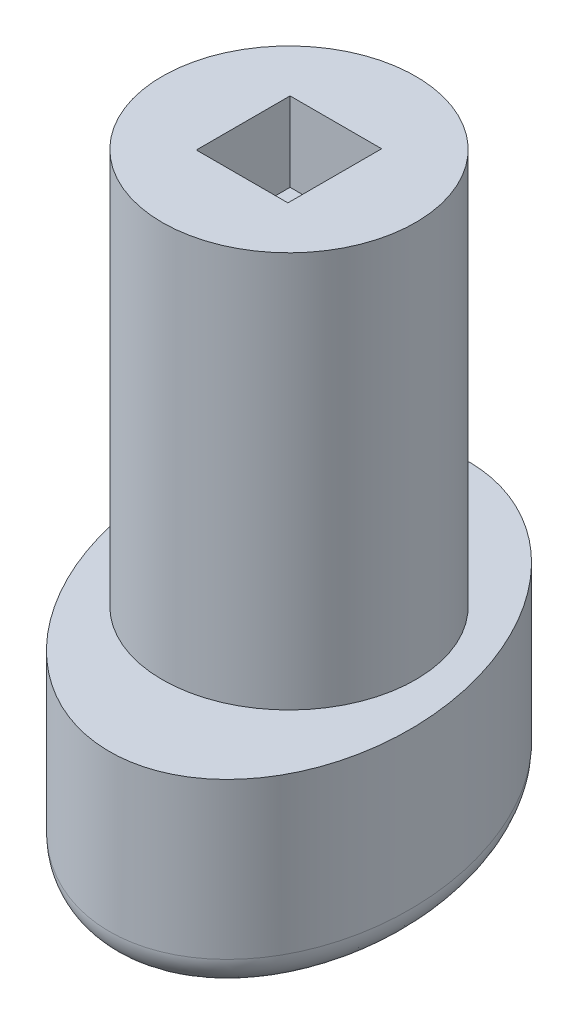
ISO-10303-21;
HEADER;
FILE_DESCRIPTION(('STEP AP214'),'2;1');
FILE_NAME('part.step','',(''),(''),'','','');
FILE_SCHEMA(('AUTOMOTIVE_DESIGN { 1 0 10303 214 1 1 1 1 }'));
ENDSEC;
DATA;
#1=APPLICATION_CONTEXT('core data for automotive mechanical design processes');
#2=APPLICATION_PROTOCOL_DEFINITION('international standard','automotive_design',2000,#1);
#3=PRODUCT_CONTEXT('',#1,'mechanical');
#4=PRODUCT('Part','Part','',(#3));
#5=PRODUCT_RELATED_PRODUCT_CATEGORY('part','',(#4));
#6=PRODUCT_DEFINITION_FORMATION('','',#4);
#7=PRODUCT_DEFINITION_CONTEXT('part definition',#1,'design');
#8=PRODUCT_DEFINITION('design','',#6,#7);
#9=PRODUCT_DEFINITION_SHAPE('','',#8);
#10=(LENGTH_UNIT() NAMED_UNIT(*) SI_UNIT(.MILLI.,.METRE.));
#11=(NAMED_UNIT(*) PLANE_ANGLE_UNIT() SI_UNIT($,.RADIAN.));
#12=(NAMED_UNIT(*) SI_UNIT($,.STERADIAN.) SOLID_ANGLE_UNIT());
#13=UNCERTAINTY_MEASURE_WITH_UNIT(LENGTH_MEASURE(1.E-05),#10,'distance_accuracy_value','');
#14=(GEOMETRIC_REPRESENTATION_CONTEXT(3) GLOBAL_UNCERTAINTY_ASSIGNED_CONTEXT((#13)) GLOBAL_UNIT_ASSIGNED_CONTEXT((#10,
#11,#12)) REPRESENTATION_CONTEXT('',''));
#15=CARTESIAN_POINT('',(0.,0.,0.));
#16=DIRECTION('',(0.,0.,1.));
#17=DIRECTION('',(1.,0.,0.));
#18=AXIS2_PLACEMENT_3D('',#15,#16,#17);
#19=CARTESIAN_POINT('',(0.,3.,0.));
#20=DIRECTION('',(0.,1.,0.));
#21=DIRECTION('',(-0.340289157419413,0.,-0.940320843830863));
#22=AXIS2_PLACEMENT_3D('',#19,#20,#21);
#23=ELLIPSE('',#22,3.556,2.54);
#24=DIRECTION('',(0.,-1.,0.));
#25=VECTOR('',#24,1.);
#26=SURFACE_OF_LINEAR_EXTRUSION('',#23,#25);
#27=CARTESIAN_POINT('',(-0.730471010995182,0.,-2.94518528881984));
#28=CARTESIAN_POINT('',(-0.785144492569507,0.,-3.44218711015709));
#29=CARTESIAN_POINT('',(-0.785144492569507,0.5,-3.44218711015709));
#30=CARTESIAN_POINT('',(-0.81489768546168,0.,-2.93589235521596));
#31=CARTESIAN_POINT('',(-0.899922225958826,0.,-3.42954435354896));
#32=CARTESIAN_POINT('',(-0.899922225958826,0.5,-3.42954435354896));
#33=CARTESIAN_POINT('',(-0.898508559988892,0.,-2.91880717279725));
#34=CARTESIAN_POINT('',(-1.01496058466802,0.,-3.40612836759495));
#35=CARTESIAN_POINT('',(-1.01496058466802,0.5,-3.40612836759495));
#36=CARTESIAN_POINT('',(-1.06083555848532,0.,-2.86877687241943));
#37=CARTESIAN_POINT('',(-1.23886538848554,0.,-3.33711275074755));
#38=CARTESIAN_POINT('',(-1.23886538848554,0.5,-3.33711275074755));
#39=CARTESIAN_POINT('',(-1.13955381588871,0.,-2.83583872274155));
#40=CARTESIAN_POINT('',(-1.34773452184082,0.,-3.29152286645141));
#41=CARTESIAN_POINT('',(-1.34773452184082,0.5,-3.29152286645141));
#42=CARTESIAN_POINT('',(-1.28036609506595,0.,-2.7604430612569));
#43=CARTESIAN_POINT('',(-1.54100195085765,0.,-3.18806073367684));
#44=CARTESIAN_POINT('',(-1.54100195085765,0.5,-3.18806073367684));
#45=CARTESIAN_POINT('',(-1.34332462021724,0.,-2.71957686103553));
#46=CARTESIAN_POINT('',(-1.62677121603788,0.,-3.13228511790827));
#47=CARTESIAN_POINT('',(-1.62677121603788,0.5,-3.13228511790827));
#48=CARTESIAN_POINT('',(-1.4621266667632,0.,-2.62858886412975));
#49=CARTESIAN_POINT('',(-1.78675294380044,0.,-3.00976182239429));
#50=CARTESIAN_POINT('',(-1.78675294380044,0.5,-3.00976182239429));
#51=CARTESIAN_POINT('',(-1.51796638079841,0.,-2.57846214944343));
#52=CARTESIAN_POINT('',(-1.86095922681993,0.,-2.9430083146739));
#53=CARTESIAN_POINT('',(-1.86095922681993,0.5,-2.9430083146739));
#54=CARTESIAN_POINT('',(-1.64141338203356,0.,-2.45096305092648));
#55=CARTESIAN_POINT('',(-2.02286825880082,0.,-2.77580390405774));
#56=CARTESIAN_POINT('',(-2.02286825880082,0.5,-2.77580390405774));
#57=CARTESIAN_POINT('',(-1.70570122684311,0.,-2.37038180638983));
#58=CARTESIAN_POINT('',(-2.10536524118031,0.,-2.67203895511301));
#59=CARTESIAN_POINT('',(-2.10536524118031,0.5,-2.67203895511301));
#60=CARTESIAN_POINT('',(-1.82048171081272,0.,-2.19994419751691));
#61=CARTESIAN_POINT('',(-2.25034115299757,0.,-2.45675892936829));
#62=CARTESIAN_POINT('',(-2.25034115299757,0.5,-2.45675892936829));
#63=CARTESIAN_POINT('',(-1.87094594266222,0.,-2.1100692488419));
#64=CARTESIAN_POINT('',(-2.31277890583431,0.,-2.34522847541224));
#65=CARTESIAN_POINT('',(-2.31277890583431,0.5,-2.34522847541224));
#66=CARTESIAN_POINT('',(-1.97800426094272,0.,-1.88469362633907));
#67=CARTESIAN_POINT('',(-2.44363144769078,0.,-2.06979116926253));
#68=CARTESIAN_POINT('',(-2.44363144769078,0.5,-2.06979116926253));
#69=CARTESIAN_POINT('',(-2.0280256511929,0.,-1.74608836214794));
#70=CARTESIAN_POINT('',(-2.50322824099576,0.,-1.90384213831112));
#71=CARTESIAN_POINT('',(-2.50322824099576,0.5,-1.90384213831112));
#72=CARTESIAN_POINT('',(-2.10578195637571,0.,-1.46279824786919));
#73=CARTESIAN_POINT('',(-2.59493398242508,0.,-1.56965766960587));
#74=CARTESIAN_POINT('',(-2.59493398242508,0.5,-1.56965766960587));
#75=CARTESIAN_POINT('',(-2.13347538475012,0.,-1.3181026037755));
#76=CARTESIAN_POINT('',(-2.62699176878793,0.,-1.40141856360819));
#77=CARTESIAN_POINT('',(-2.62699176878793,0.5,-1.40141856360819));
#78=CARTESIAN_POINT('',(-2.16432813321979,0.,-1.06801680554859));
#79=CARTESIAN_POINT('',(-2.66250851344363,0.,-1.11346658607708));
#80=CARTESIAN_POINT('',(-2.66250851344363,0.5,-1.11346658607708));
#81=CARTESIAN_POINT('',(-2.17222835269463,0.,-0.963168016220344));
#82=CARTESIAN_POINT('',(-2.67151197471953,0.,-0.993578563802488));
#83=CARTESIAN_POINT('',(-2.67151197471953,0.5,-0.993578563802488));
#84=CARTESIAN_POINT('',(-2.17894110868656,0.,-0.753161636583998));
#85=CARTESIAN_POINT('',(-2.67914717635678,0.,-0.754694162717866));
#86=CARTESIAN_POINT('',(-2.67914717635678,0.5,-0.754694162717866));
#87=CARTESIAN_POINT('',(-2.17774986504002,0.,-0.648003936000331));
#88=CARTESIAN_POINT('',(-2.6777746024411,0.,-0.635698175395758));
#89=CARTESIAN_POINT('',(-2.6777746024411,0.5,-0.635698175395758));
#90=CARTESIAN_POINT('',(-2.1615690060014,0.,-0.333129924693955));
#91=CARTESIAN_POINT('',(-2.65954053656584,0.,-0.280715056169561));
#92=CARTESIAN_POINT('',(-2.65954053656584,0.5,-0.280715056169561));
#93=CARTESIAN_POINT('',(-2.13397569484041,0.,-0.123980917801874));
#94=CARTESIAN_POINT('',(-2.62856653205763,0.,-0.0466963984730983));
#95=CARTESIAN_POINT('',(-2.62856653205763,0.5,-0.0466963984730983));
#96=CARTESIAN_POINT('',(-2.04780552301204,0.,0.293643445334162));
#97=CARTESIAN_POINT('',(-2.53244870884226,0.,0.419092544820542));
#98=CARTESIAN_POINT('',(-2.53244870884226,0.5,0.419092544820542));
#99=CARTESIAN_POINT('',(-1.98839605907958,0.,0.501941518637557));
#100=CARTESIAN_POINT('',(-2.46638707633696,0.,0.650623292784962));
#101=CARTESIAN_POINT('',(-2.46638707633696,0.5,0.650623292784962));
#102=CARTESIAN_POINT('',(-1.84031944572305,0.,0.90788867722582));
#103=CARTESIAN_POINT('',(-2.30177914404577,0.,1.10189094562089));
#104=CARTESIAN_POINT('',(-2.30177914404577,0.5,1.10189094562089));
#105=CARTESIAN_POINT('',(-1.75164979191361,0.,1.1055368492985));
#106=CARTESIAN_POINT('',(-2.20323006365361,0.,1.32162683909614));
#107=CARTESIAN_POINT('',(-2.20323006365361,0.5,1.32162683909614));
#108=CARTESIAN_POINT('',(-1.54932816794133,0.,1.47920729978586));
#109=CARTESIAN_POINT('',(-1.97752592017151,0.,1.73850244473853));
#110=CARTESIAN_POINT('',(-1.97752592017151,0.5,1.73850244473853));
#111=CARTESIAN_POINT('',(-1.43662456935511,0.,1.65573544284738));
#112=CARTESIAN_POINT('',(-1.85145336505489,0.,1.93615553816759));
#113=CARTESIAN_POINT('',(-1.85145336505489,0.5,1.93615553816759));
#114=CARTESIAN_POINT('',(-1.24776797292666,0.,1.90531107551697));
#115=CARTESIAN_POINT('',(-1.63843877024675,0.,2.21764284977897));
#116=CARTESIAN_POINT('',(-1.63843877024675,0.5,2.21764284977897));
#117=CARTESIAN_POINT('',(-1.18152579218462,0.,1.98595705371092));
#118=CARTESIAN_POINT('',(-1.56346127701999,0.,2.30896198245016));
#119=CARTESIAN_POINT('',(-1.56346127701999,0.5,2.30896198245016));
#120=CARTESIAN_POINT('',(-1.04235097471278,0.,2.14122692452285));
#121=CARTESIAN_POINT('',(-1.40506531668567,0.,2.48567733885662));
#122=CARTESIAN_POINT('',(-1.40506531668567,0.5,2.48567733885662));
#123=CARTESIAN_POINT('',(-0.969421350434968,0.,2.21585350046461));
#124=CARTESIAN_POINT('',(-1.32165064849273,0.,2.57107619931288));
#125=CARTESIAN_POINT('',(-1.32165064849273,0.5,2.57107619931288));
#126=CARTESIAN_POINT('',(-0.791984675083535,0.,2.38098256869189));
#127=CARTESIAN_POINT('',(-1.11722737940361,0.,2.76132773972219));
#128=CARTESIAN_POINT('',(-1.11722737940361,0.5,2.76132773972219));
#129=CARTESIAN_POINT('',(-0.684913180590488,0.,2.46877255884947));
#130=CARTESIAN_POINT('',(-0.992806203206982,0.,2.86349398953435));
#131=CARTESIAN_POINT('',(-0.992806203206983,0.5,2.86349398953435));
#132=CARTESIAN_POINT('',(-0.459016842541146,0.,2.62769753921258));
#133=CARTESIAN_POINT('',(-0.726567662121788,0.,3.05081739350604));
#134=CARTESIAN_POINT('',(-0.726567662121788,0.5,3.05081739350604));
#135=CARTESIAN_POINT('',(-0.340209468753977,0.,2.6988567695375));
#136=CARTESIAN_POINT('',(-0.58477608105497,0.,3.13599927623143));
#137=CARTESIAN_POINT('',(-0.58477608105497,0.5,3.13599927623143));
#138=CARTESIAN_POINT('',(-0.124254862782633,0.,2.80319893164604));
#139=CARTESIAN_POINT('',(-0.32181559333763,0.,3.26304448310769));
#140=CARTESIAN_POINT('',(-0.32181559333763,0.5,3.26304448310769));
#141=CARTESIAN_POINT('',(-0.0295706001214522,0.,2.84144668909322));
#142=CARTESIAN_POINT('',(-0.204953562813145,0.,3.31041059652297));
#143=CARTESIAN_POINT('',(-0.204953562813145,0.5,3.31041059652297));
#144=CARTESIAN_POINT('',(0.164686733969052,0.,2.9027050114404));
#145=CARTESIAN_POINT('',(0.0392210338017717,0.,3.38741299961639));
#146=CARTESIAN_POINT('',(0.0392210338017715,0.5,3.38741299961639));
#147=CARTESIAN_POINT('',(0.26425391733135,0.,2.92573346573911));
#148=CARTESIAN_POINT('',(0.166521131906821,0.,3.41707010122745));
#149=CARTESIAN_POINT('',(0.166521131906821,0.5,3.41707010122745));
#150=CARTESIAN_POINT('',(0.444402042920759,0.,2.95011439060232));
#151=CARTESIAN_POINT('',(0.401483783608818,0.,3.44886008286069));
#152=CARTESIAN_POINT('',(0.401483783608818,0.5,3.44886008286069));
#153=CARTESIAN_POINT('',(0.524492806207562,0.,2.955047631363));
#154=CARTESIAN_POINT('',(0.507528589185382,0.,3.45552085498266));
#155=CARTESIAN_POINT('',(0.507528589185382,0.5,3.45552085498266));
#156=CARTESIAN_POINT('',(0.684330191267244,0.,2.95168891345141));
#157=CARTESIAN_POINT('',(0.722096587566092,0.,3.45099932981075));
#158=CARTESIAN_POINT('',(0.722096587566092,0.5,3.45099932981075));
#159=CARTESIAN_POINT('',(0.764077166659706,0.,2.94343125835332));
#160=CARTESIAN_POINT('',(0.830612630853739,0.,3.43986331390675));
#161=CARTESIAN_POINT('',(0.830612630853739,0.5,3.43986331390674));
#162=CARTESIAN_POINT('',(0.875948517205769,0.,2.92164929652531));
#163=CARTESIAN_POINT('',(0.98401563864138,0.,3.40999850794159));
#164=CARTESIAN_POINT('',(0.984015638641381,0.5,3.40999850794159));
#165=CARTESIAN_POINT('',(0.909250100982067,0.,2.91382948892636));
#166=CARTESIAN_POINT('',(1.029833988143,0.,3.39924277068809));
#167=CARTESIAN_POINT('',(1.02983398814301,0.5,3.39924277068809));
#168=CARTESIAN_POINT('',(0.975155996317847,0.,2.89563752929529));
#169=CARTESIAN_POINT('',(1.12066189928518,0.,3.37417249502259));
#170=CARTESIAN_POINT('',(1.12066189928518,0.5,3.3741724950226));
#171=CARTESIAN_POINT('',(1.00776015148015,0.,2.88526481116585));
#172=CARTESIAN_POINT('',(1.16567127916152,0.,3.35985716727891));
#173=CARTESIAN_POINT('',(1.16567127916152,0.5,3.35985716727891));
#174=CARTESIAN_POINT('',(1.1149244663784,0.,2.84646759583103));
#175=CARTESIAN_POINT('',(1.31359573658709,0.,3.30629336897836));
#176=CARTESIAN_POINT('',(1.31359573658709,0.5,3.30629336897836));
#177=CARTESIAN_POINT('',(1.18752924844856,0.,2.81240031036022));
#178=CARTESIAN_POINT('',(1.41379317876911,0.,3.25923069822097));
#179=CARTESIAN_POINT('',(1.41379317876911,0.5,3.25923069822097));
#180=CARTESIAN_POINT('',(1.32564350778145,0.,2.73197243441348));
#181=CARTESIAN_POINT('',(1.602757690793,0.,3.14920831876257));
#182=CARTESIAN_POINT('',(1.602757690793,0.5,3.14920831876257));
#183=CARTESIAN_POINT('',(1.39113827530862,0.,2.68558701728831));
#184=CARTESIAN_POINT('',(1.69150113275132,0.,3.08621651799011));
#185=CARTESIAN_POINT('',(1.69150113275132,0.5,3.08621651799011));
#186=CARTESIAN_POINT('',(1.51329401990618,0.,2.58328454525604));
#187=CARTESIAN_POINT('',(1.85485116468335,0.,2.94942663712318));
#188=CARTESIAN_POINT('',(1.85485116468335,0.5,2.94942663712318));
#189=CARTESIAN_POINT('',(1.57001654686296,0.,2.52744026104798));
#190=CARTESIAN_POINT('',(1.92955712677572,0.,2.87571162429183));
#191=CARTESIAN_POINT('',(1.92955712677572,0.5,2.87571162429183));
#192=CARTESIAN_POINT('',(1.67492650255634,0.,2.40833265619828));
#193=CARTESIAN_POINT('',(2.0658335392793,0.,2.72099122487934));
#194=CARTESIAN_POINT('',(2.0658335392793,0.5,2.72099122487934));
#195=CARTESIAN_POINT('',(1.72311232390547,0.,2.34506794207353));
#196=CARTESIAN_POINT('',(2.12740151636745,0.,2.63998446964768));
#197=CARTESIAN_POINT('',(2.12740151636745,0.5,2.63998446964768));
#198=CARTESIAN_POINT('',(1.83611728321779,0.,2.17581264817431));
#199=CARTESIAN_POINT('',(2.27001304453329,0.,2.42641494298061));
#200=CARTESIAN_POINT('',(2.27001304453329,0.5,2.42641494298061));
#201=CARTESIAN_POINT('',(1.89499140064603,0.,2.06584778944419));
#202=CARTESIAN_POINT('',(2.34245828720163,0.,2.29054091353212));
#203=CARTESIAN_POINT('',(2.34245828720163,0.5,2.29054091353212));
#204=CARTESIAN_POINT('',(1.99464877269713,0.,1.83798805303207));
#205=CARTESIAN_POINT('',(2.46343664048845,0.,2.01389097807368));
#206=CARTESIAN_POINT('',(2.46343664048845,0.5,2.01389097807368));
#207=CARTESIAN_POINT('',(2.03538381649757,0.,1.72007299029043));
#208=CARTESIAN_POINT('',(2.5119060645418,0.,1.87310306886219));
#209=CARTESIAN_POINT('',(2.5119060645418,0.5,1.87310306886219));
#210=CARTESIAN_POINT('',(2.115639679733,0.,1.42569423243151));
#211=CARTESIAN_POINT('',(2.6065607759414,0.,1.52596295789045));
#212=CARTESIAN_POINT('',(2.6065607759414,0.5,1.52596295789045));
#213=CARTESIAN_POINT('',(2.14631425947081,0.,1.24682562398539));
#214=CARTESIAN_POINT('',(2.64184134068041,0.,1.31869883133375));
#215=CARTESIAN_POINT('',(2.64184134068041,0.5,1.31869883133375));
#216=CARTESIAN_POINT('',(2.17926703875737,0.,0.886644548104238));
#217=CARTESIAN_POINT('',(2.67958497607501,0.,0.905835379563996));
#218=CARTESIAN_POINT('',(2.67958497607501,0.5,0.905835379563996));
#219=CARTESIAN_POINT('',(2.18150398315006,0.,0.70532891206962));
#220=CARTESIAN_POINT('',(2.68200036879828,0.,0.70023890535146));
#221=CARTESIAN_POINT('',(2.68200036879828,0.5,0.70023890535146));
#222=CARTESIAN_POINT('',(2.15793151067772,0.,0.285174278215467));
#223=CARTESIAN_POINT('',(2.6554472209351,0.,0.22677661948283));
#224=CARTESIAN_POINT('',(2.6554472209351,0.5,0.22677661948283));
#225=CARTESIAN_POINT('',(2.12274246558242,0.,0.0468496575992637));
#226=CARTESIAN_POINT('',(2.61599218155926,0.,-0.0395419906370937));
#227=CARTESIAN_POINT('',(2.61599218155926,0.5,-0.0395419906370937));
#228=CARTESIAN_POINT('',(2.01413964057488,0.,-0.420954874689913));
#229=CARTESIAN_POINT('',(2.49497332442414,0.,-0.560752328354205));
#230=CARTESIAN_POINT('',(2.49497332442414,0.5,-0.560752328354205));
#231=CARTESIAN_POINT('',(1.94067544432023,0.,-0.650422690871272));
#232=CARTESIAN_POINT('',(2.41335396868462,0.,-0.815628501750752));
#233=CARTESIAN_POINT('',(2.41335396868462,0.5,-0.815628501750752));
#234=CARTESIAN_POINT('',(1.75698144848971,0.,-1.09729127048005));
#235=CARTESIAN_POINT('',(2.20910566069016,0.,-1.31253270329458));
#236=CARTESIAN_POINT('',(2.20910566069016,0.5,-1.31253270329458));
#237=CARTESIAN_POINT('',(1.64636715559664,0.,-1.31453687990382));
#238=CARTESIAN_POINT('',(2.08604779447107,0.,-1.55439432910023));
#239=CARTESIAN_POINT('',(2.08604779447107,0.5,-1.55439432910023));
#240=CARTESIAN_POINT('',(1.45384470062081,0.,-1.62338912064243));
#241=CARTESIAN_POINT('',(1.87049471550201,0.,-1.90017195271356));
#242=CARTESIAN_POINT('',(1.87049471550201,0.5,-1.90017195271356));
#243=CARTESIAN_POINT('',(1.38526759279026,0.,-1.72346966232578));
#244=CARTESIAN_POINT('',(1.79351713703229,0.,-2.01255659003266));
#245=CARTESIAN_POINT('',(1.79351713703228,0.5,-2.01255659003266));
#246=CARTESIAN_POINT('',(1.239152108757,0.,-1.9168285880354));
#247=CARTESIAN_POINT('',(1.62873034571256,0.,-2.23062708100691));
#248=CARTESIAN_POINT('',(1.62873034571256,0.5,-2.23062708100691));
#249=CARTESIAN_POINT('',(1.16161888204784,0.,-2.01011083104678));
#250=CARTESIAN_POINT('',(1.54092735520575,0.,-2.33631673047583));
#251=CARTESIAN_POINT('',(1.54092735520575,0.5,-2.33631673047583));
#252=CARTESIAN_POINT('',(0.977602251724129,0.,-2.20996715794137));
#253=CARTESIAN_POINT('',(1.33115371066955,0.,-2.56415408508665));
#254=CARTESIAN_POINT('',(1.33115371066955,0.5,-2.56415408508665));
#255=CARTESIAN_POINT('',(0.868652254200762,0.,-2.31429974561207));
#256=CARTESIAN_POINT('',(1.2060553073395,0.,-2.6841003236202));
#257=CARTESIAN_POINT('',(1.2060553073395,0.5,-2.6841003236202));
#258=CARTESIAN_POINT('',(0.636691689018581,0.,-2.50598898535162));
#259=CARTESIAN_POINT('',(0.936342912680717,0.,-2.90700734034106));
#260=CARTESIAN_POINT('',(0.936342912680717,0.5,-2.90700734034106));
#261=CARTESIAN_POINT('',(0.513702115966277,0.,-2.59337047106581));
#262=CARTESIAN_POINT('',(0.791758004218087,0.,-3.00999293220692));
#263=CARTESIAN_POINT('',(0.791758004218087,0.5,-3.00999293220692));
#264=CARTESIAN_POINT('',(0.288641499088612,0.,-2.72496419912978));
#265=CARTESIAN_POINT('',(0.522167002683943,0.,-3.16761439457773));
#266=CARTESIAN_POINT('',(0.522167002683943,0.5,-3.16761439457772));
#267=CARTESIAN_POINT('',(0.189686767037582,0.,-2.7744782880101));
#268=CARTESIAN_POINT('',(0.402155353589188,0.,-3.2278275481157));
#269=CARTESIAN_POINT('',(0.402155353589188,0.5,-3.2278275481157));
#270=CARTESIAN_POINT('',(-0.0147357327424044,0.,-2.85765829816546));
#271=CARTESIAN_POINT('',(0.149774521358249,0.,-3.33053090504018));
#272=CARTESIAN_POINT('',(0.149774521358249,0.5,-3.33053090504018));
#273=CARTESIAN_POINT('',(-0.120193745595248,0.,-2.89134733281446));
#274=CARTESIAN_POINT('',(0.017423701262284,0.,-3.37304694563829));
#275=CARTESIAN_POINT('',(0.017423701262284,0.5,-3.37304694563829));
#276=CARTESIAN_POINT('',(-0.310244259914807,0.,-2.93308537648859));
#277=CARTESIAN_POINT('',(-0.226204425730848,0.,-3.42653949735898));
#278=CARTESIAN_POINT('',(-0.226204425730848,0.5,-3.42653949735898));
#279=CARTESIAN_POINT('',(-0.393909698831788,0.,-2.94530154522807));
#280=CARTESIAN_POINT('',(-0.335115563772279,0.,-3.44258247831226));
#281=CARTESIAN_POINT('',(-0.335115563772279,0.5,-3.44258247831226));
#282=CARTESIAN_POINT('',(-0.562142065225715,0.,-2.95595483061486));
#283=CARTESIAN_POINT('',(-0.557650201028664,0.,-3.45666933394923));
#284=CARTESIAN_POINT('',(-0.557650201028664,0.5,-3.45666933394923));
#285=CARTESIAN_POINT('',(-0.646708049944397,0.,-2.95440516678411));
#286=CARTESIAN_POINT('',(-0.671269074970275,0.,-3.45473047676525));
#287=CARTESIAN_POINT('',(-0.671269074970275,0.5,-3.45473047676525));
#288=CARTESIAN_POINT('',(-0.730471010995182,0.,-2.94518528881984));
#289=CARTESIAN_POINT('',(-0.785144492569507,0.,-3.44218711015709));
#290=CARTESIAN_POINT('',(-0.785144492569507,0.5,-3.44218711015709));
#291=(BOUNDED_SURFACE() B_SPLINE_SURFACE(3,2,((#27,#28,#29),(#30,#31,#32),(#33,#34,#35),(#36,
#37,#38),(#39,#40,#41),(#42,#43,#44),(#45,#46,#47),(#48,#49,#50),(#51,#52,#53),(#54,#55,#56),
(#57,#58,#59),(#60,#61,#62),(#63,#64,#65),(#66,#67,#68),(#69,#70,#71),(#72,#73,#74),(#75,#76,
#77),(#78,#79,#80),(#81,#82,#83),(#84,#85,#86),(#87,#88,#89),(#90,#91,#92),(#93,#94,#95),(#96,
#97,#98),(#99,#100,#101),(#102,#103,#104),(#105,#106,#107),(#108,#109,#110),(#111,#112,#113),
(#114,#115,#116),(#117,#118,#119),(#120,#121,#122),(#123,#124,#125),(#126,#127,#128),(#129,#130,
#131),(#132,#133,#134),(#135,#136,#137),(#138,#139,#140),(#141,#142,#143),(#144,#145,#146),
(#147,#148,#149),(#150,#151,#152),(#153,#154,#155),(#156,#157,#158),(#159,#160,#161),(#162,#163,
#164),(#165,#166,#167),(#168,#169,#170),(#171,#172,#173),(#174,#175,#176),(#177,#178,#179),
(#180,#181,#182),(#183,#184,#185),(#186,#187,#188),(#189,#190,#191),(#192,#193,#194),(#195,#196,
#197),(#198,#199,#200),(#201,#202,#203),(#204,#205,#206),(#207,#208,#209),(#210,#211,#212),
(#213,#214,#215),(#216,#217,#218),(#219,#220,#221),(#222,#223,#224),(#225,#226,#227),(#228,#229,
#230),(#231,#232,#233),(#234,#235,#236),(#237,#238,#239),(#240,#241,#242),(#243,#244,#245),
(#246,#247,#248),(#249,#250,#251),(#252,#253,#254),(#255,#256,#257),(#258,#259,#260),(#261,#262,
#263),(#264,#265,#266),(#267,#268,#269),(#270,#271,#272),(#273,#274,#275),(#276,#277,#278),
(#279,#280,#281),(#282,#283,#284),(#285,#286,#287),(#288,#289,#290)),.UNSPECIFIED.,.T.,.F.,
.F.) B_SPLINE_SURFACE_WITH_KNOTS((4,2,2,2,2,2,2,2,2,2,2,2,2,2,2,2,2,2,2,2,2,2,2,2,2,2,2,2,2,2,2,
2,2,2,2,2,2,2,2,2,2,2,2,4),(3,3),(0.,0.254463906370809,0.508816063384492,0.73301660586317,
0.957336559094977,1.26487451110622,1.57303978695656,2.01270032564984,2.45317590681608,
2.76821268465752,3.08338045961356,3.71362125332019,4.36122410853795,5.00888240659319,
5.63459405316776,5.94736593828293,6.25999761667374,6.67413624904062,7.08766743685803,
7.39303181206059,7.69803660790496,7.93785495081144,8.17705064894386,8.27958575698794,
8.38214362228421,8.62129417575024,8.86093043362175,9.09880050151043,9.33671531077313,
9.70880457360505,10.081876973346,10.6233334973743,11.1655754358116,11.8845658424798,
12.604505712558,13.3321389623744,13.6956843637846,14.0590217685348,14.51023137531,
14.9607748759475,15.2916928298116,15.6221259451078,15.8748320551968,16.127295514321),(0.,1.),
.UNSPECIFIED.) GEOMETRIC_REPRESENTATION_ITEM() RATIONAL_B_SPLINE_SURFACE(((1.,0.707106781186548,
1.),(1.,0.707106781186548,1.),(1.,0.707106781186548,1.),(1.,0.707106781186548,1.),(1.,
0.707106781186548,1.),(1.,0.707106781186548,1.),(1.,0.707106781186548,1.),(1.,0.707106781186548,
1.),(1.,0.707106781186548,1.),(1.,0.707106781186548,1.),(1.,0.707106781186548,1.),(1.,
0.707106781186548,1.),(1.,0.707106781186548,1.),(1.,0.707106781186548,1.),(1.,0.707106781186548,
1.),(1.,0.707106781186548,1.),(1.,0.707106781186548,1.),(1.,0.707106781186548,1.),(1.,
0.707106781186548,1.),(1.,0.707106781186548,1.),(1.,0.707106781186548,1.),(1.,0.707106781186548,
1.),(1.,0.707106781186548,1.),(1.,0.707106781186548,1.),(1.,0.707106781186548,1.),(1.,
0.707106781186548,1.),(1.,0.707106781186548,1.),(1.,0.707106781186548,1.),(1.,0.707106781186548,
1.),(1.,0.707106781186548,1.),(1.,0.707106781186548,1.),(1.,0.707106781186548,1.),(1.,
0.707106781186548,1.),(1.,0.707106781186548,1.),(1.,0.707106781186548,1.),(1.,0.707106781186548,
1.),(1.,0.707106781186548,1.),(1.,0.707106781186548,1.),(1.,0.707106781186548,1.),(1.,
0.707106781186548,1.),(1.,0.707106781186548,1.),(1.,0.707106781186548,1.),(1.,0.707106781186548,
1.),(1.,0.707106781186548,1.),(1.,0.707106781186548,1.),(1.,0.707106781186548,1.),(1.,
0.707106781186548,1.),(1.,0.707106781186548,1.),(1.,0.707106781186548,1.),(1.,0.707106781186548,
1.),(1.,0.707106781186548,1.),(1.,0.707106781186548,1.),(1.,0.707106781186548,1.),(1.,
0.707106781186548,1.),(1.,0.707106781186548,1.),(1.,0.707106781186548,1.),(1.,0.707106781186548,
1.),(1.,0.707106781186548,1.),(1.,0.707106781186548,1.),(1.,0.707106781186548,1.),(1.,
0.707106781186548,1.),(1.,0.707106781186548,1.),(1.,0.707106781186548,1.),(1.,0.707106781186548,
1.),(1.,0.707106781186548,1.),(1.,0.707106781186548,1.),(1.,0.707106781186548,1.),(1.,
0.707106781186548,1.),(1.,0.707106781186548,1.),(1.,0.707106781186548,1.),(1.,0.707106781186548,
1.),(1.,0.707106781186548,1.),(1.,0.707106781186548,1.),(1.,0.707106781186548,1.),(1.,
0.707106781186548,1.),(1.,0.707106781186548,1.),(1.,0.707106781186548,1.),(1.,0.707106781186548,
1.),(1.,0.707106781186548,1.),(1.,0.707106781186548,1.),(1.,0.707106781186548,1.),(1.,
0.707106781186548,1.),(1.,0.707106781186548,1.),(1.,0.707106781186548,1.),(1.,0.707106781186548,
1.),(1.,0.707106781186548,1.),(1.,0.707106781186548,1.),(1.,0.707106781186548,1.))) REPRESENTATION_ITEM('') SURFACE());
#292=CARTESIAN_POINT('',(-0.785144492569507,0.5,-3.44218711015709));
#293=CARTESIAN_POINT('',(-0.899922225958827,0.5,-3.42954435354896));
#294=CARTESIAN_POINT('',(-1.01496058466802,0.5,-3.40612836759495));
#295=CARTESIAN_POINT('',(-1.23886538848554,0.5,-3.33711275074755));
#296=CARTESIAN_POINT('',(-1.34773452184082,0.5,-3.29152286645141));
#297=CARTESIAN_POINT('',(-1.54100195085765,0.5,-3.18806073367684));
#298=CARTESIAN_POINT('',(-1.62677121603788,0.5,-3.13228511790827));
#299=CARTESIAN_POINT('',(-1.78675294380044,0.5,-3.00976182239429));
#300=CARTESIAN_POINT('',(-1.86095922681993,0.5,-2.9430083146739));
#301=CARTESIAN_POINT('',(-2.02286825880082,0.5,-2.77580390405774));
#302=CARTESIAN_POINT('',(-2.10536524118031,0.5,-2.67203895511301));
#303=CARTESIAN_POINT('',(-2.25034115299757,0.5,-2.45675892936829));
#304=CARTESIAN_POINT('',(-2.31277890583431,0.5,-2.34522847541224));
#305=CARTESIAN_POINT('',(-2.44363144769078,0.5,-2.06979116926253));
#306=CARTESIAN_POINT('',(-2.50322824099576,0.5,-1.90384213831112));
#307=CARTESIAN_POINT('',(-2.59493398242508,0.5,-1.56965766960587));
#308=CARTESIAN_POINT('',(-2.62699176878793,0.5,-1.40141856360819));
#309=CARTESIAN_POINT('',(-2.66250851344363,0.5,-1.11346658607708));
#310=CARTESIAN_POINT('',(-2.67151197471953,0.5,-0.993578563802489));
#311=CARTESIAN_POINT('',(-2.67914717635678,0.5,-0.754694162717866));
#312=CARTESIAN_POINT('',(-2.6777746024411,0.5,-0.635698175395758));
#313=CARTESIAN_POINT('',(-2.65954053656584,0.5,-0.280715056169561));
#314=CARTESIAN_POINT('',(-2.62856653205763,0.5,-0.0466963984730983));
#315=CARTESIAN_POINT('',(-2.53244870884226,0.5,0.419092544820542));
#316=CARTESIAN_POINT('',(-2.46638707633696,0.5,0.650623292784962));
#317=CARTESIAN_POINT('',(-2.30177914404577,0.5,1.10189094562089));
#318=CARTESIAN_POINT('',(-2.20323006365361,0.5,1.32162683909614));
#319=CARTESIAN_POINT('',(-1.97752592017151,0.5,1.73850244473853));
#320=CARTESIAN_POINT('',(-1.85145336505489,0.5,1.93615553816759));
#321=CARTESIAN_POINT('',(-1.63843877024675,0.5,2.21764284977897));
#322=CARTESIAN_POINT('',(-1.56346127701999,0.5,2.30896198245016));
#323=CARTESIAN_POINT('',(-1.40506531668567,0.5,2.48567733885662));
#324=CARTESIAN_POINT('',(-1.32165064849273,0.5,2.57107619931288));
#325=CARTESIAN_POINT('',(-1.11722737940361,0.5,2.76132773972219));
#326=CARTESIAN_POINT('',(-0.992806203206982,0.5,2.86349398953435));
#327=CARTESIAN_POINT('',(-0.726567662121788,0.5,3.05081739350604));
#328=CARTESIAN_POINT('',(-0.58477608105497,0.5,3.13599927623143));
#329=CARTESIAN_POINT('',(-0.32181559333763,0.5,3.26304448310769));
#330=CARTESIAN_POINT('',(-0.204953562813145,0.5,3.31041059652297));
#331=CARTESIAN_POINT('',(0.0392210338017714,0.5,3.38741299961639));
#332=CARTESIAN_POINT('',(0.166521131906821,0.5,3.41707010122745));
#333=CARTESIAN_POINT('',(0.401483783608818,0.5,3.44886008286069));
#334=CARTESIAN_POINT('',(0.507528589185382,0.5,3.45552085498266));
#335=CARTESIAN_POINT('',(0.722096587566093,0.5,3.45099932981075));
#336=CARTESIAN_POINT('',(0.830612630853739,0.5,3.43986331390674));
#337=CARTESIAN_POINT('',(0.98401563864138,0.5,3.40999850794159));
#338=CARTESIAN_POINT('',(1.029833988143,0.5,3.39924277068809));
#339=CARTESIAN_POINT('',(1.12066189928518,0.5,3.3741724950226));
#340=CARTESIAN_POINT('',(1.16567127916152,0.5,3.35985716727891));
#341=CARTESIAN_POINT('',(1.31359573658709,0.5,3.30629336897836));
#342=CARTESIAN_POINT('',(1.41379317876911,0.5,3.25923069822097));
#343=CARTESIAN_POINT('',(1.602757690793,0.5,3.14920831876257));
#344=CARTESIAN_POINT('',(1.69150113275132,0.5,3.08621651799011));
#345=CARTESIAN_POINT('',(1.85485116468335,0.5,2.94942663712318));
#346=CARTESIAN_POINT('',(1.92955712677572,0.5,2.87571162429183));
#347=CARTESIAN_POINT('',(2.0658335392793,0.5,2.72099122487934));
#348=CARTESIAN_POINT('',(2.12740151636745,0.5,2.63998446964768));
#349=CARTESIAN_POINT('',(2.27001304453329,0.5,2.42641494298061));
#350=CARTESIAN_POINT('',(2.34245828720163,0.5,2.29054091353212));
#351=CARTESIAN_POINT('',(2.46343664048845,0.5,2.01389097807368));
#352=CARTESIAN_POINT('',(2.5119060645418,0.5,1.87310306886219));
#353=CARTESIAN_POINT('',(2.6065607759414,0.5,1.52596295789045));
#354=CARTESIAN_POINT('',(2.64184134068041,0.5,1.31869883133375));
#355=CARTESIAN_POINT('',(2.67958497607501,0.5,0.905835379563997));
#356=CARTESIAN_POINT('',(2.68200036879828,0.5,0.700238905351459));
#357=CARTESIAN_POINT('',(2.6554472209351,0.5,0.226776619482829));
#358=CARTESIAN_POINT('',(2.61599218155926,0.5,-0.0395419906370936));
#359=CARTESIAN_POINT('',(2.49497332442414,0.5,-0.560752328354205));
#360=CARTESIAN_POINT('',(2.41335396868462,0.5,-0.815628501750753));
#361=CARTESIAN_POINT('',(2.20910566069016,0.5,-1.31253270329458));
#362=CARTESIAN_POINT('',(2.08604779447107,0.5,-1.55439432910023));
#363=CARTESIAN_POINT('',(1.87049471550201,0.5,-1.90017195271356));
#364=CARTESIAN_POINT('',(1.79351713703228,0.5,-2.01255659003266));
#365=CARTESIAN_POINT('',(1.62873034571256,0.5,-2.23062708100691));
#366=CARTESIAN_POINT('',(1.54092735520575,0.5,-2.33631673047583));
#367=CARTESIAN_POINT('',(1.33115371066955,0.5,-2.56415408508665));
#368=CARTESIAN_POINT('',(1.2060553073395,0.5,-2.6841003236202));
#369=CARTESIAN_POINT('',(0.936342912680717,0.5,-2.90700734034106));
#370=CARTESIAN_POINT('',(0.791758004218087,0.5,-3.00999293220692));
#371=CARTESIAN_POINT('',(0.522167002683943,0.5,-3.16761439457772));
#372=CARTESIAN_POINT('',(0.402155353589188,0.5,-3.2278275481157));
#373=CARTESIAN_POINT('',(0.149774521358249,0.5,-3.33053090504018));
#374=CARTESIAN_POINT('',(0.0174237012622838,0.5,-3.37304694563829));
#375=CARTESIAN_POINT('',(-0.226204425730848,0.5,-3.42653949735898));
#376=CARTESIAN_POINT('',(-0.335115563772278,0.5,-3.44258247831226));
#377=CARTESIAN_POINT('',(-0.557650201028663,0.5,-3.45666933394923));
#378=CARTESIAN_POINT('',(-0.671269074970275,0.5,-3.45473047676525));
#379=CARTESIAN_POINT('',(-0.785144492569507,0.5,-3.44218711015709));
#380=B_SPLINE_CURVE_WITH_KNOTS('',3,(#292,#293,#294,#295,#296,#297,#298,#299,#300,#301,#302,
#303,#304,#305,#306,#307,#308,#309,#310,#311,#312,#313,#314,#315,#316,#317,#318,#319,#320,#321,
#322,#323,#324,#325,#326,#327,#328,#329,#330,#331,#332,#333,#334,#335,#336,#337,#338,#339,#340,
#341,#342,#343,#344,#345,#346,#347,#348,#349,#350,#351,#352,#353,#354,#355,#356,#357,#358,#359,
#360,#361,#362,#363,#364,#365,#366,#367,#368,#369,#370,#371,#372,#373,#374,#375,#376,#377,#378,
#379),.UNSPECIFIED.,.T.,.F.,(4,2,2,2,2,2,2,2,2,2,2,2,2,2,2,2,2,2,2,2,2,2,2,2,2,2,2,2,2,2,2,2,2,
2,2,2,2,2,2,2,2,2,2,4),(0.,0.254463906370809,0.508816063384492,0.73301660586317,
0.957336559094977,1.26487451110622,1.57303978695656,2.01270032564984,2.45317590681608,
2.76821268465752,3.08338045961356,3.71362125332019,4.36122410853795,5.00888240659319,
5.63459405316776,5.94736593828293,6.25999761667374,6.67413624904062,7.08766743685803,
7.39303181206059,7.69803660790496,7.93785495081144,8.17705064894386,8.27958575698794,
8.38214362228421,8.62129417575024,8.86093043362175,9.09880050151043,9.33671531077313,
9.70880457360505,10.081876973346,10.6233334973743,11.1655754358116,11.8845658424798,
12.604505712558,13.3321389623744,13.6956843637846,14.0590217685348,14.51023137531,
14.9607748759475,15.2916928298116,15.6221259451078,15.8748320551968,16.127295514321),.UNSPECIFIED.);
#381=CARTESIAN_POINT('',(-0.785144492569507,0.5,-3.44218711015709));
#382=VERTEX_POINT('',#381);
#383=EDGE_CURVE('E54',#382,#382,#380,.T.);
#384=ORIENTED_EDGE('',*,*,#383,.T.);
#385=EDGE_LOOP('',(#384));
#386=FACE_BOUND('',#385,.T.);
#387=CARTESIAN_POINT('',(-1.21006824378343,3.,-3.34378092066255));
#388=VERTEX_POINT('',#387);
#389=EDGE_CURVE('E140',#388,#388,#23,.T.);
#390=ORIENTED_EDGE('',*,*,#389,.F.);
#391=EDGE_LOOP('',(#390));
#392=FACE_BOUND('',#391,.T.);
#393=ADVANCED_FACE('F41',(#386,#392),#26,.F.);
#394=CARTESIAN_POINT('',(0.,3.,0.));
#395=DIRECTION('',(0.,1.,0.));
#396=DIRECTION('',(0.,0.,1.));
#397=AXIS2_PLACEMENT_3D('',#394,#395,#396);
#398=PLANE('',#397);
#399=CARTESIAN_POINT('',(0.,3.,0.));
#400=DIRECTION('',(0.,1.,0.));
#401=DIRECTION('',(0.,0.,1.));
#402=AXIS2_PLACEMENT_3D('',#399,#400,#401);
#403=CIRCLE('',#402,2.032);
#404=CARTESIAN_POINT('',(0.,3.,2.032));
#405=VERTEX_POINT('',#404);
#406=EDGE_CURVE('E141',#405,#405,#403,.T.);
#407=ORIENTED_EDGE('',*,*,#406,.F.);
#408=EDGE_LOOP('',(#407));
#409=FACE_BOUND('',#408,.T.);
#410=ORIENTED_EDGE('',*,*,#389,.T.);
#411=EDGE_LOOP('',(#410));
#412=FACE_BOUND('',#411,.T.);
#413=ADVANCED_FACE('F157',(#409,#412),#398,.T.);
#414=CARTESIAN_POINT('',(0.,0.,0.));
#415=DIRECTION('',(0.,1.,0.));
#416=DIRECTION('',(0.,0.,1.));
#417=AXIS2_PLACEMENT_3D('',#414,#415,#416);
#418=PLANE('',#417);
#419=CARTESIAN_POINT('',(-0.730471010995182,0.,-2.94518528881984));
#420=CARTESIAN_POINT('',(-0.646708049944396,0.,-2.95440516678411));
#421=CARTESIAN_POINT('',(-0.562142065225715,0.,-2.95595483061486));
#422=CARTESIAN_POINT('',(-0.393909698831787,0.,-2.94530154522807));
#423=CARTESIAN_POINT('',(-0.310244259914807,0.,-2.93308537648859));
#424=CARTESIAN_POINT('',(-0.120193745595248,0.,-2.89134733281446));
#425=CARTESIAN_POINT('',(-0.0147357327424046,0.,-2.85765829816546));
#426=CARTESIAN_POINT('',(0.189686767037582,0.,-2.77447828801011));
#427=CARTESIAN_POINT('',(0.288641499088612,0.,-2.72496419912978));
#428=CARTESIAN_POINT('',(0.513702115966277,0.,-2.59337047106581));
#429=CARTESIAN_POINT('',(0.636691689018581,0.,-2.50598898535162));
#430=CARTESIAN_POINT('',(0.868652254200762,0.,-2.31429974561207));
#431=CARTESIAN_POINT('',(0.977602251724129,0.,-2.20996715794137));
#432=CARTESIAN_POINT('',(1.16161888204784,0.,-2.01011083104678));
#433=CARTESIAN_POINT('',(1.239152108757,0.,-1.9168285880354));
#434=CARTESIAN_POINT('',(1.38526759279026,0.,-1.72346966232578));
#435=CARTESIAN_POINT('',(1.45384470062081,0.,-1.62338912064243));
#436=CARTESIAN_POINT('',(1.64636715559664,0.,-1.31453687990382));
#437=CARTESIAN_POINT('',(1.75698144848971,0.,-1.09729127048005));
#438=CARTESIAN_POINT('',(1.94067544432023,0.,-0.650422690871272));
#439=CARTESIAN_POINT('',(2.01413964057488,0.,-0.420954874689913));
#440=CARTESIAN_POINT('',(2.12274246558242,0.,0.046849657599264));
#441=CARTESIAN_POINT('',(2.15793151067772,0.,0.285174278215466));
#442=CARTESIAN_POINT('',(2.18150398315006,0.,0.70532891206962));
#443=CARTESIAN_POINT('',(2.17926703875737,0.,0.886644548104238));
#444=CARTESIAN_POINT('',(2.14631425947081,0.,1.24682562398539));
#445=CARTESIAN_POINT('',(2.115639679733,0.,1.42569423243151));
#446=CARTESIAN_POINT('',(2.03538381649757,0.,1.72007299029043));
#447=CARTESIAN_POINT('',(1.99464877269713,0.,1.83798805303207));
#448=CARTESIAN_POINT('',(1.89499140064603,0.,2.06584778944419));
#449=CARTESIAN_POINT('',(1.83611728321779,0.,2.17581264817431));
#450=CARTESIAN_POINT('',(1.72311232390547,0.,2.34506794207353));
#451=CARTESIAN_POINT('',(1.67492650255634,0.,2.40833265619828));
#452=CARTESIAN_POINT('',(1.57001654686296,0.,2.52744026104798));
#453=CARTESIAN_POINT('',(1.51329401990618,0.,2.58328454525604));
#454=CARTESIAN_POINT('',(1.39113827530862,0.,2.6855870172883));
#455=CARTESIAN_POINT('',(1.32564350778145,0.,2.73197243441348));
#456=CARTESIAN_POINT('',(1.18752924844856,0.,2.81240031036022));
#457=CARTESIAN_POINT('',(1.1149244663784,0.,2.84646759583103));
#458=CARTESIAN_POINT('',(1.00776015148015,0.,2.88526481116585));
#459=CARTESIAN_POINT('',(0.975155996317847,0.,2.89563752929529));
#460=CARTESIAN_POINT('',(0.909250100982067,0.,2.91382948892636));
#461=CARTESIAN_POINT('',(0.875948517205768,0.,2.92164929652531));
#462=CARTESIAN_POINT('',(0.764077166659706,0.,2.94343125835332));
#463=CARTESIAN_POINT('',(0.684330191267244,0.,2.95168891345141));
#464=CARTESIAN_POINT('',(0.524492806207563,0.,2.955047631363));
#465=CARTESIAN_POINT('',(0.444402042920759,0.,2.95011439060232));
#466=CARTESIAN_POINT('',(0.26425391733135,0.,2.92573346573911));
#467=CARTESIAN_POINT('',(0.164686733969052,0.,2.9027050114404));
#468=CARTESIAN_POINT('',(-0.0295706001214521,0.,2.84144668909322));
#469=CARTESIAN_POINT('',(-0.124254862782633,0.,2.80319893164604));
#470=CARTESIAN_POINT('',(-0.340209468753977,0.,2.6988567695375));
#471=CARTESIAN_POINT('',(-0.459016842541146,0.,2.62769753921258));
#472=CARTESIAN_POINT('',(-0.684913180590488,0.,2.46877255884947));
#473=CARTESIAN_POINT('',(-0.791984675083535,0.,2.38098256869189));
#474=CARTESIAN_POINT('',(-0.969421350434968,0.,2.21585350046461));
#475=CARTESIAN_POINT('',(-1.04235097471278,0.,2.14122692452285));
#476=CARTESIAN_POINT('',(-1.18152579218462,0.,1.98595705371092));
#477=CARTESIAN_POINT('',(-1.24776797292666,0.,1.90531107551697));
#478=CARTESIAN_POINT('',(-1.43662456935511,0.,1.65573544284738));
#479=CARTESIAN_POINT('',(-1.54932816794133,0.,1.47920729978586));
#480=CARTESIAN_POINT('',(-1.75164979191361,0.,1.1055368492985));
#481=CARTESIAN_POINT('',(-1.84031944572305,0.,0.90788867722582));
#482=CARTESIAN_POINT('',(-1.98839605907958,0.,0.501941518637557));
#483=CARTESIAN_POINT('',(-2.04780552301204,0.,0.293643445334162));
#484=CARTESIAN_POINT('',(-2.13397569484041,0.,-0.123980917801873));
#485=CARTESIAN_POINT('',(-2.1615690060014,0.,-0.333129924693954));
#486=CARTESIAN_POINT('',(-2.17774986504002,0.,-0.648003936000331));
#487=CARTESIAN_POINT('',(-2.17894110868656,0.,-0.753161636583998));
#488=CARTESIAN_POINT('',(-2.17222835269463,0.,-0.963168016220344));
#489=CARTESIAN_POINT('',(-2.16432813321979,0.,-1.06801680554859));
#490=CARTESIAN_POINT('',(-2.13347538475012,0.,-1.3181026037755));
#491=CARTESIAN_POINT('',(-2.10578195637571,0.,-1.46279824786919));
#492=CARTESIAN_POINT('',(-2.0280256511929,0.,-1.74608836214794));
#493=CARTESIAN_POINT('',(-1.97800426094272,0.,-1.88469362633907));
#494=CARTESIAN_POINT('',(-1.87094594266222,0.,-2.1100692488419));
#495=CARTESIAN_POINT('',(-1.82048171081272,0.,-2.19994419751691));
#496=CARTESIAN_POINT('',(-1.70570122684311,0.,-2.37038180638983));
#497=CARTESIAN_POINT('',(-1.64141338203356,0.,-2.45096305092648));
#498=CARTESIAN_POINT('',(-1.51796638079841,0.,-2.57846214944343));
#499=CARTESIAN_POINT('',(-1.4621266667632,0.,-2.62858886412975));
#500=CARTESIAN_POINT('',(-1.34332462021724,0.,-2.71957686103553));
#501=CARTESIAN_POINT('',(-1.28036609506595,0.,-2.7604430612569));
#502=CARTESIAN_POINT('',(-1.13955381588871,0.,-2.83583872274155));
#503=CARTESIAN_POINT('',(-1.06083555848532,0.,-2.86877687241943));
#504=CARTESIAN_POINT('',(-0.898508559988892,0.,-2.91880717279725));
#505=CARTESIAN_POINT('',(-0.81489768546168,0.,-2.93589235521596));
#506=CARTESIAN_POINT('',(-0.730471010995182,0.,-2.94518528881984));
#507=B_SPLINE_CURVE_WITH_KNOTS('',3,(#419,#420,#421,#422,#423,#424,#425,#426,#427,#428,#429,
#430,#431,#432,#433,#434,#435,#436,#437,#438,#439,#440,#441,#442,#443,#444,#445,#446,#447,#448,
#449,#450,#451,#452,#453,#454,#455,#456,#457,#458,#459,#460,#461,#462,#463,#464,#465,#466,#467,
#468,#469,#470,#471,#472,#473,#474,#475,#476,#477,#478,#479,#480,#481,#482,#483,#484,#485,#486,
#487,#488,#489,#490,#491,#492,#493,#494,#495,#496,#497,#498,#499,#500,#501,#502,#503,#504,#505,
#506),.UNSPECIFIED.,.T.,.F.,(4,2,2,2,2,2,2,2,2,2,2,2,2,2,2,2,2,2,2,2,2,2,2,2,2,2,2,2,2,2,2,2,2,
2,2,2,2,2,2,2,2,2,2,4),(0.,0.252463459124244,0.505169569213199,0.835602684509466,
1.16652063837352,1.61706413901102,2.06827374578622,2.43161115053646,2.79515655194657,
3.52278980176304,4.24272967184127,4.96172007850946,5.50396201694677,6.04541854097505,
6.41849094071597,6.79058020354789,7.02849501281059,7.26636508069927,7.50600133857078,
7.74515189203681,7.84770975733308,7.95024486537716,8.18944056350958,8.42925890641606,
8.73426370226043,9.03962807746299,9.4531592652804,9.86729789764728,10.1799295760381,
10.4927014611533,11.1184131077278,11.7660714057831,12.4136742610008,13.0439150547075,
13.3590828296635,13.6741196075049,14.1145951886712,14.5542557273645,14.8624210032148,
15.169958955226,15.3942789084578,15.6184794509365,15.8728316079502,16.127295514321),.UNSPECIFIED.);
#508=CARTESIAN_POINT('',(-0.730471010995182,0.,-2.94518528881984));
#509=VERTEX_POINT('',#508);
#510=EDGE_CURVE('E11',#509,#509,#507,.T.);
#511=ORIENTED_EDGE('',*,*,#510,.T.);
#512=EDGE_LOOP('',(#511));
#513=FACE_BOUND('',#512,.T.);
#514=ADVANCED_FACE('F159',(#513),#418,.F.);
#515=CARTESIAN_POINT('',(0.,9.35,0.));
#516=DIRECTION('',(0.,-1.,0.));
#517=DIRECTION('',(0.,0.,-1.));
#518=AXIS2_PLACEMENT_3D('',#515,#516,#517);
#519=CYLINDRICAL_SURFACE('',#518,2.032);
#520=CARTESIAN_POINT('',(0.,9.35,0.));
#521=DIRECTION('',(0.,1.,0.));
#522=DIRECTION('',(0.,0.,1.));
#523=AXIS2_PLACEMENT_3D('',#520,#521,#522);
#524=CIRCLE('',#523,2.032);
#525=CARTESIAN_POINT('',(0.,9.35,2.032));
#526=VERTEX_POINT('',#525);
#527=EDGE_CURVE('E132',#526,#526,#524,.T.);
#528=ORIENTED_EDGE('',*,*,#527,.F.);
#529=EDGE_LOOP('',(#528));
#530=FACE_BOUND('',#529,.T.);
#531=ORIENTED_EDGE('',*,*,#406,.T.);
#532=EDGE_LOOP('',(#531));
#533=FACE_BOUND('',#532,.T.);
#534=ADVANCED_FACE('F194',(#530,#533),#519,.T.);
#535=CARTESIAN_POINT('',(0.,9.35,0.));
#536=DIRECTION('',(0.,1.,0.));
#537=DIRECTION('',(0.,0.,1.));
#538=AXIS2_PLACEMENT_3D('',#535,#536,#537);
#539=PLANE('',#538);
#540=DIRECTION('',(0.,0.,-1.));
#541=VECTOR('',#540,1.);
#542=CARTESIAN_POINT('',(0.734382806592304,9.35,0.751594903621842));
#543=LINE('',#542,#541);
#544=CARTESIAN_POINT('',(0.734382806592304,9.35,0.751594903621842));
#545=VERTEX_POINT('',#544);
#546=CARTESIAN_POINT('',(0.734382806592304,9.35,-0.751594903621842));
#547=VERTEX_POINT('',#546);
#548=EDGE_CURVE('E61',#545,#547,#543,.T.);
#549=ORIENTED_EDGE('',*,*,#548,.F.);
#550=DIRECTION('',(1.,0.,0.));
#551=VECTOR('',#550,1.);
#552=CARTESIAN_POINT('',(-0.734382806592304,9.35,0.751594903621842));
#553=LINE('',#552,#551);
#554=CARTESIAN_POINT('',(-0.734382806592304,9.35,0.751594903621842));
#555=VERTEX_POINT('',#554);
#556=EDGE_CURVE('E116',#555,#545,#553,.T.);
#557=ORIENTED_EDGE('',*,*,#556,.F.);
#558=DIRECTION('',(0.,0.,1.));
#559=VECTOR('',#558,1.);
#560=CARTESIAN_POINT('',(-0.734382806592304,9.35,0.751594903621842));
#561=LINE('',#560,#559);
#562=CARTESIAN_POINT('',(-0.734382806592304,9.35,-0.751594903621842));
#563=VERTEX_POINT('',#562);
#564=EDGE_CURVE('E125',#563,#555,#561,.T.);
#565=ORIENTED_EDGE('',*,*,#564,.F.);
#566=DIRECTION('',(-1.,0.,0.));
#567=VECTOR('',#566,1.);
#568=CARTESIAN_POINT('',(-0.734382806592304,9.35,-0.751594903621842));
#569=LINE('',#568,#567);
#570=EDGE_CURVE('E96',#547,#563,#569,.T.);
#571=ORIENTED_EDGE('',*,*,#570,.F.);
#572=EDGE_LOOP('',(#549,#557,#565,#571));
#573=FACE_BOUND('',#572,.T.);
#574=ORIENTED_EDGE('',*,*,#527,.T.);
#575=EDGE_LOOP('',(#574));
#576=FACE_BOUND('',#575,.T.);
#577=ADVANCED_FACE('F200',(#573,#576),#539,.T.);
#578=CARTESIAN_POINT('',(0.734382806592304,8.08,0.751594903621842));
#579=DIRECTION('',(1.,0.,0.));
#580=DIRECTION('',(0.,0.,-1.));
#581=AXIS2_PLACEMENT_3D('',#578,#579,#580);
#582=PLANE('',#581);
#583=ORIENTED_EDGE('',*,*,#548,.T.);
#584=DIRECTION('',(0.,1.,0.));
#585=VECTOR('',#584,1.);
#586=CARTESIAN_POINT('',(0.734382806592304,8.08,-0.751594903621842));
#587=LINE('',#586,#585);
#588=CARTESIAN_POINT('',(0.734382806592304,8.08,-0.751594903621842));
#589=VERTEX_POINT('',#588);
#590=EDGE_CURVE('E84',#589,#547,#587,.T.);
#591=ORIENTED_EDGE('',*,*,#590,.F.);
#592=DIRECTION('',(0.,0.,-1.));
#593=VECTOR('',#592,1.);
#594=CARTESIAN_POINT('',(0.734382806592304,8.08,0.751594903621842));
#595=LINE('',#594,#593);
#596=CARTESIAN_POINT('',(0.734382806592304,8.08,0.751594903621842));
#597=VERTEX_POINT('',#596);
#598=EDGE_CURVE('E112',#597,#589,#595,.T.);
#599=ORIENTED_EDGE('',*,*,#598,.F.);
#600=DIRECTION('',(0.,1.,0.));
#601=VECTOR('',#600,1.);
#602=CARTESIAN_POINT('',(0.734382806592304,8.08,0.751594903621842));
#603=LINE('',#602,#601);
#604=EDGE_CURVE('E69',#597,#545,#603,.T.);
#605=ORIENTED_EDGE('',*,*,#604,.T.);
#606=EDGE_LOOP('',(#583,#591,#599,#605));
#607=FACE_BOUND('',#606,.T.);
#608=ADVANCED_FACE('F204',(#607),#582,.F.);
#609=CARTESIAN_POINT('',(-0.734382806592304,8.08,0.751594903621842));
#610=DIRECTION('',(0.,0.,1.));
#611=DIRECTION('',(1.,0.,0.));
#612=AXIS2_PLACEMENT_3D('',#609,#610,#611);
#613=PLANE('',#612);
#614=ORIENTED_EDGE('',*,*,#556,.T.);
#615=ORIENTED_EDGE('',*,*,#604,.F.);
#616=DIRECTION('',(1.,0.,0.));
#617=VECTOR('',#616,1.);
#618=CARTESIAN_POINT('',(-0.734382806592304,8.08,0.751594903621842));
#619=LINE('',#618,#617);
#620=CARTESIAN_POINT('',(-0.734382806592304,8.08,0.751594903621842));
#621=VERTEX_POINT('',#620);
#622=EDGE_CURVE('E109',#621,#597,#619,.T.);
#623=ORIENTED_EDGE('',*,*,#622,.F.);
#624=DIRECTION('',(0.,1.,0.));
#625=VECTOR('',#624,1.);
#626=CARTESIAN_POINT('',(-0.734382806592304,8.08,0.751594903621842));
#627=LINE('',#626,#625);
#628=EDGE_CURVE('E101',#621,#555,#627,.T.);
#629=ORIENTED_EDGE('',*,*,#628,.T.);
#630=EDGE_LOOP('',(#614,#615,#623,#629));
#631=FACE_BOUND('',#630,.T.);
#632=ADVANCED_FACE('F208',(#631),#613,.F.);
#633=CARTESIAN_POINT('',(-0.734382806592304,8.08,0.751594903621842));
#634=DIRECTION('',(-1.,0.,0.));
#635=DIRECTION('',(0.,0.,1.));
#636=AXIS2_PLACEMENT_3D('',#633,#634,#635);
#637=PLANE('',#636);
#638=ORIENTED_EDGE('',*,*,#564,.T.);
#639=ORIENTED_EDGE('',*,*,#628,.F.);
#640=DIRECTION('',(0.,0.,1.));
#641=VECTOR('',#640,1.);
#642=CARTESIAN_POINT('',(-0.734382806592304,8.08,0.751594903621842));
#643=LINE('',#642,#641);
#644=CARTESIAN_POINT('',(-0.734382806592304,8.08,-0.751594903621842));
#645=VERTEX_POINT('',#644);
#646=EDGE_CURVE('E104',#645,#621,#643,.T.);
#647=ORIENTED_EDGE('',*,*,#646,.F.);
#648=DIRECTION('',(0.,1.,0.));
#649=VECTOR('',#648,1.);
#650=CARTESIAN_POINT('',(-0.734382806592304,8.08,-0.751594903621842));
#651=LINE('',#650,#649);
#652=EDGE_CURVE('E89',#645,#563,#651,.T.);
#653=ORIENTED_EDGE('',*,*,#652,.T.);
#654=EDGE_LOOP('',(#638,#639,#647,#653));
#655=FACE_BOUND('',#654,.T.);
#656=ADVANCED_FACE('F105',(#655),#637,.F.);
#657=CARTESIAN_POINT('',(-0.734382806592304,8.08,-0.751594903621842));
#658=DIRECTION('',(0.,0.,-1.));
#659=DIRECTION('',(-1.,0.,0.));
#660=AXIS2_PLACEMENT_3D('',#657,#658,#659);
#661=PLANE('',#660);
#662=ORIENTED_EDGE('',*,*,#570,.T.);
#663=ORIENTED_EDGE('',*,*,#652,.F.);
#664=DIRECTION('',(-1.,0.,0.));
#665=VECTOR('',#664,1.);
#666=CARTESIAN_POINT('',(-0.734382806592304,8.08,-0.751594903621842));
#667=LINE('',#666,#665);
#668=EDGE_CURVE('E93',#589,#645,#667,.T.);
#669=ORIENTED_EDGE('',*,*,#668,.F.);
#670=ORIENTED_EDGE('',*,*,#590,.T.);
#671=EDGE_LOOP('',(#662,#663,#669,#670));
#672=FACE_BOUND('',#671,.T.);
#673=ADVANCED_FACE('F91',(#672),#661,.F.);
#674=CARTESIAN_POINT('',(0.,8.08,0.));
#675=DIRECTION('',(0.,-1.,0.));
#676=DIRECTION('',(0.,0.,-1.));
#677=AXIS2_PLACEMENT_3D('',#674,#675,#676);
#678=PLANE('',#677);
#679=ORIENTED_EDGE('',*,*,#598,.T.);
#680=ORIENTED_EDGE('',*,*,#668,.T.);
#681=ORIENTED_EDGE('',*,*,#646,.T.);
#682=ORIENTED_EDGE('',*,*,#622,.T.);
#683=EDGE_LOOP('',(#679,#680,#681,#682));
#684=FACE_BOUND('',#683,.T.);
#685=ADVANCED_FACE('F111',(#684),#678,.F.);
#686=CARTESIAN_POINT('',(-0.730471010995182,0.5,-2.94518528881984));
#687=DIRECTION('',(0.994003642674496,0.,-0.10934696314865));
#688=DIRECTION('',(0.,-1.,0.));
#689=AXIS2_PLACEMENT_3D('',#686,#687,#688);
#690=CIRCLE('',#689,0.5);
#691=EDGE_CURVE('',#509,#382,#690,.T.);
#692=ORIENTED_EDGE('',*,*,#510,.F.);
#693=ORIENTED_EDGE('',*,*,#383,.F.);
#694=ORIENTED_EDGE('',*,*,#691,.T.);
#695=ORIENTED_EDGE('',*,*,#691,.F.);
#696=EDGE_LOOP('',(#692,#694,#693,#695));
#697=FACE_BOUND('',#696,.T.);
#698=ADVANCED_FACE('F167',(#697),#291,.T.);
#699=CLOSED_SHELL('',(#393,#413,#514,#534,#577,#608,#632,#656,#673,#685,#698));
#700=MANIFOLD_SOLID_BREP('B2',#699);
#701=ADVANCED_BREP_SHAPE_REPRESENTATION('',(#18,#700),#14);
#702=SHAPE_DEFINITION_REPRESENTATION(#9,#701);
ENDSEC;
END-ISO-10303-21;
